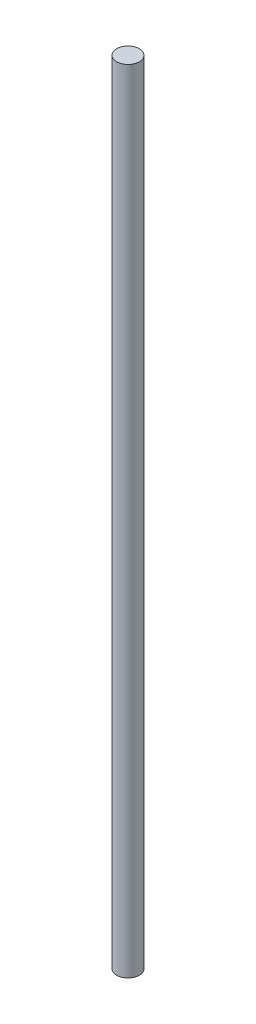
ISO-10303-21;
HEADER;
FILE_DESCRIPTION(('STEP AP214'),'2;1');
FILE_NAME('part.step','',(''),(''),'','','');
FILE_SCHEMA(('AUTOMOTIVE_DESIGN { 1 0 10303 214 1 1 1 1 }'));
ENDSEC;
DATA;
#1=APPLICATION_CONTEXT('core data for automotive mechanical design processes');
#2=APPLICATION_PROTOCOL_DEFINITION('international standard','automotive_design',2000,#1);
#3=PRODUCT_CONTEXT('',#1,'mechanical');
#4=PRODUCT('Part','Part','',(#3));
#5=PRODUCT_RELATED_PRODUCT_CATEGORY('part','',(#4));
#6=PRODUCT_DEFINITION_FORMATION('','',#4);
#7=PRODUCT_DEFINITION_CONTEXT('part definition',#1,'design');
#8=PRODUCT_DEFINITION('design','',#6,#7);
#9=PRODUCT_DEFINITION_SHAPE('','',#8);
#10=(LENGTH_UNIT() NAMED_UNIT(*) SI_UNIT(.MILLI.,.METRE.));
#11=(NAMED_UNIT(*) PLANE_ANGLE_UNIT() SI_UNIT($,.RADIAN.));
#12=(NAMED_UNIT(*) SI_UNIT($,.STERADIAN.) SOLID_ANGLE_UNIT());
#13=UNCERTAINTY_MEASURE_WITH_UNIT(LENGTH_MEASURE(1.E-05),#10,'distance_accuracy_value','');
#14=(GEOMETRIC_REPRESENTATION_CONTEXT(3) GLOBAL_UNCERTAINTY_ASSIGNED_CONTEXT((#13)) GLOBAL_UNIT_ASSIGNED_CONTEXT((#10,
#11,#12)) REPRESENTATION_CONTEXT('',''));
#15=CARTESIAN_POINT('',(0.,0.,0.));
#16=DIRECTION('',(0.,0.,1.));
#17=DIRECTION('',(1.,0.,0.));
#18=AXIS2_PLACEMENT_3D('',#15,#16,#17);
#19=CARTESIAN_POINT('',(0.,35.,0.));
#20=DIRECTION('',(0.,-1.,0.));
#21=DIRECTION('',(0.,0.,-1.));
#22=AXIS2_PLACEMENT_3D('',#19,#20,#21);
#23=CYLINDRICAL_SURFACE('',#22,0.5);
#24=CARTESIAN_POINT('',(0.,35.,0.));
#25=DIRECTION('',(0.,1.,0.));
#26=DIRECTION('',(0.,0.,1.));
#27=AXIS2_PLACEMENT_3D('',#24,#25,#26);
#28=CIRCLE('',#27,0.5);
#29=CARTESIAN_POINT('',(0.,35.,0.5));
#30=VERTEX_POINT('',#29);
#31=EDGE_CURVE('E10',#30,#30,#28,.T.);
#32=ORIENTED_EDGE('',*,*,#31,.F.);
#33=EDGE_LOOP('',(#32));
#34=FACE_BOUND('',#33,.T.);
#35=CARTESIAN_POINT('',(0.,0.,0.));
#36=DIRECTION('',(0.,1.,0.));
#37=DIRECTION('',(0.,0.,1.));
#38=AXIS2_PLACEMENT_3D('',#35,#36,#37);
#39=CIRCLE('',#38,0.5);
#40=CARTESIAN_POINT('',(0.,0.,0.5));
#41=VERTEX_POINT('',#40);
#42=EDGE_CURVE('E35',#41,#41,#39,.T.);
#43=ORIENTED_EDGE('',*,*,#42,.T.);
#44=EDGE_LOOP('',(#43));
#45=FACE_BOUND('',#44,.T.);
#46=ADVANCED_FACE('F32',(#34,#45),#23,.T.);
#47=CARTESIAN_POINT('',(0.,35.,0.));
#48=DIRECTION('',(0.,1.,0.));
#49=DIRECTION('',(0.,0.,1.));
#50=AXIS2_PLACEMENT_3D('',#47,#48,#49);
#51=PLANE('',#50);
#52=ORIENTED_EDGE('',*,*,#31,.T.);
#53=EDGE_LOOP('',(#52));
#54=FACE_BOUND('',#53,.T.);
#55=ADVANCED_FACE('F47',(#54),#51,.T.);
#56=CARTESIAN_POINT('',(0.,0.,0.));
#57=DIRECTION('',(0.,1.,0.));
#58=DIRECTION('',(0.,0.,1.));
#59=AXIS2_PLACEMENT_3D('',#56,#57,#58);
#60=PLANE('',#59);
#61=ORIENTED_EDGE('',*,*,#42,.F.);
#62=EDGE_LOOP('',(#61));
#63=FACE_BOUND('',#62,.T.);
#64=ADVANCED_FACE('F45',(#63),#60,.F.);
#65=CLOSED_SHELL('',(#46,#55,#64));
#66=MANIFOLD_SOLID_BREP('B2',#65);
#67=ADVANCED_BREP_SHAPE_REPRESENTATION('',(#18,#66),#14);
#68=SHAPE_DEFINITION_REPRESENTATION(#9,#67);
ENDSEC;
END-ISO-10303-21;
